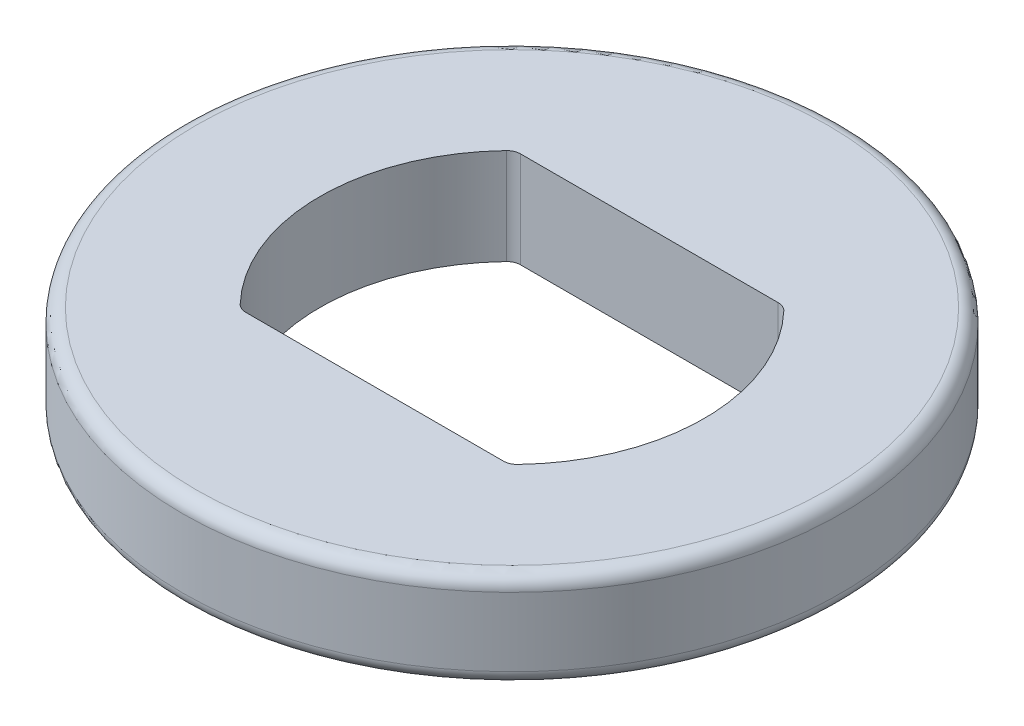
ISO-10303-21;
HEADER;
FILE_DESCRIPTION(('STEP AP214'),'2;1');
FILE_NAME('part.step','',(''),(''),'','','');
FILE_SCHEMA(('AUTOMOTIVE_DESIGN { 1 0 10303 214 1 1 1 1 }'));
ENDSEC;
DATA;
#1=APPLICATION_CONTEXT('core data for automotive mechanical design processes');
#2=APPLICATION_PROTOCOL_DEFINITION('international standard','automotive_design',2000,#1);
#3=PRODUCT_CONTEXT('',#1,'mechanical');
#4=PRODUCT('Part','Part','',(#3));
#5=PRODUCT_RELATED_PRODUCT_CATEGORY('part','',(#4));
#6=PRODUCT_DEFINITION_FORMATION('','',#4);
#7=PRODUCT_DEFINITION_CONTEXT('part definition',#1,'design');
#8=PRODUCT_DEFINITION('design','',#6,#7);
#9=PRODUCT_DEFINITION_SHAPE('','',#8);
#10=(LENGTH_UNIT() NAMED_UNIT(*) SI_UNIT(.MILLI.,.METRE.));
#11=(NAMED_UNIT(*) PLANE_ANGLE_UNIT() SI_UNIT($,.RADIAN.));
#12=(NAMED_UNIT(*) SI_UNIT($,.STERADIAN.) SOLID_ANGLE_UNIT());
#13=UNCERTAINTY_MEASURE_WITH_UNIT(LENGTH_MEASURE(1.E-05),#10,'distance_accuracy_value','');
#14=(GEOMETRIC_REPRESENTATION_CONTEXT(3) GLOBAL_UNCERTAINTY_ASSIGNED_CONTEXT((#13)) GLOBAL_UNIT_ASSIGNED_CONTEXT((#10,
#11,#12)) REPRESENTATION_CONTEXT('',''));
#15=CARTESIAN_POINT('',(0.,0.,0.));
#16=DIRECTION('',(0.,0.,1.));
#17=DIRECTION('',(1.,0.,0.));
#18=AXIS2_PLACEMENT_3D('',#15,#16,#17);
#19=CARTESIAN_POINT('',(0.,3.5,0.));
#20=DIRECTION('',(0.,-1.,0.));
#21=DIRECTION('',(0.,0.,-1.));
#22=AXIS2_PLACEMENT_3D('',#19,#20,#21);
#23=CYLINDRICAL_SURFACE('',#22,12.);
#24=CARTESIAN_POINT('',(0.,3.,0.));
#25=DIRECTION('',(0.,1.,0.));
#26=DIRECTION('',(0.,0.,1.));
#27=AXIS2_PLACEMENT_3D('',#24,#25,#26);
#28=CIRCLE('',#27,12.);
#29=CARTESIAN_POINT('',(0.,3.,12.));
#30=VERTEX_POINT('',#29);
#31=EDGE_CURVE('E176',#30,#30,#28,.F.);
#32=ORIENTED_EDGE('',*,*,#31,.T.);
#33=EDGE_LOOP('',(#32));
#34=FACE_BOUND('',#33,.T.);
#35=CARTESIAN_POINT('',(0.,0.5,0.));
#36=DIRECTION('',(0.,1.,0.));
#37=DIRECTION('',(0.,0.,1.));
#38=AXIS2_PLACEMENT_3D('',#35,#36,#37);
#39=CIRCLE('',#38,12.);
#40=CARTESIAN_POINT('',(0.,0.5,12.));
#41=VERTEX_POINT('',#40);
#42=EDGE_CURVE('E173',#41,#41,#39,.T.);
#43=ORIENTED_EDGE('',*,*,#42,.T.);
#44=EDGE_LOOP('',(#43));
#45=FACE_BOUND('',#44,.T.);
#46=ADVANCED_FACE('F34',(#34,#45),#23,.T.);
#47=CARTESIAN_POINT('',(0.,3.5,0.));
#48=DIRECTION('',(0.,1.,0.));
#49=DIRECTION('',(0.,0.,1.));
#50=AXIS2_PLACEMENT_3D('',#47,#48,#49);
#51=PLANE('',#50);
#52=CARTESIAN_POINT('',(0.,3.5,0.));
#53=DIRECTION('',(0.,1.,0.));
#54=DIRECTION('',(0.,0.,1.));
#55=AXIS2_PLACEMENT_3D('',#52,#53,#54);
#56=CIRCLE('',#55,11.5);
#57=CARTESIAN_POINT('',(0.,3.5,11.5));
#58=VERTEX_POINT('',#57);
#59=EDGE_CURVE('E163',#58,#58,#56,.T.);
#60=ORIENTED_EDGE('',*,*,#59,.T.);
#61=EDGE_LOOP('',(#60));
#62=FACE_BOUND('',#61,.T.);
#63=DIRECTION('',(1.,0.,0.));
#64=VECTOR('',#63,1.);
#65=CARTESIAN_POINT('',(4.89897948556636,3.5,-5.));
#66=LINE('',#65,#64);
#67=CARTESIAN_POINT('',(-4.69041575982343,3.5,-5.));
#68=VERTEX_POINT('',#67);
#69=CARTESIAN_POINT('',(4.69041575982343,3.5,-5.));
#70=VERTEX_POINT('',#69);
#71=EDGE_CURVE('E106',#68,#70,#66,.T.);
#72=ORIENTED_EDGE('',*,*,#71,.T.);
#73=CARTESIAN_POINT('',(4.69041575982343,3.5,-4.5));
#74=DIRECTION('',(0.,1.,0.));
#75=DIRECTION('',(0.,0.,1.));
#76=AXIS2_PLACEMENT_3D('',#73,#74,#75);
#77=CIRCLE('',#76,0.5);
#78=CARTESIAN_POINT('',(5.05121697211754,3.5,-4.84615384615384));
#79=VERTEX_POINT('',#78);
#80=EDGE_CURVE('E100',#70,#79,#77,.F.);
#81=ORIENTED_EDGE('',*,*,#80,.T.);
#82=CARTESIAN_POINT('',(0.,3.5,0.));
#83=DIRECTION('',(0.,-1.,0.));
#84=DIRECTION('',(0.,0.,-1.));
#85=AXIS2_PLACEMENT_3D('',#82,#83,#84);
#86=CIRCLE('',#85,7.);
#87=CARTESIAN_POINT('',(5.05121697211754,3.5,4.84615384615385));
#88=VERTEX_POINT('',#87);
#89=EDGE_CURVE('E103',#79,#88,#86,.T.);
#90=ORIENTED_EDGE('',*,*,#89,.T.);
#91=CARTESIAN_POINT('',(4.69041575982343,3.5,4.5));
#92=DIRECTION('',(0.,1.,0.));
#93=DIRECTION('',(0.,0.,1.));
#94=AXIS2_PLACEMENT_3D('',#91,#92,#93);
#95=CIRCLE('',#94,0.5);
#96=CARTESIAN_POINT('',(4.69041575982343,3.5,5.));
#97=VERTEX_POINT('',#96);
#98=EDGE_CURVE('E140',#88,#97,#95,.F.);
#99=ORIENTED_EDGE('',*,*,#98,.T.);
#100=DIRECTION('',(-1.,0.,0.));
#101=VECTOR('',#100,1.);
#102=CARTESIAN_POINT('',(4.89897948556635,3.5,5.));
#103=LINE('',#102,#101);
#104=CARTESIAN_POINT('',(-4.69041575982343,3.5,5.));
#105=VERTEX_POINT('',#104);
#106=EDGE_CURVE('E121',#97,#105,#103,.T.);
#107=ORIENTED_EDGE('',*,*,#106,.T.);
#108=CARTESIAN_POINT('',(-4.69041575982343,3.5,4.5));
#109=DIRECTION('',(0.,1.,0.));
#110=DIRECTION('',(0.,0.,1.));
#111=AXIS2_PLACEMENT_3D('',#108,#109,#110);
#112=CIRCLE('',#111,0.5);
#113=CARTESIAN_POINT('',(-5.05121697211754,3.5,4.84615384615385));
#114=VERTEX_POINT('',#113);
#115=EDGE_CURVE('E11',#105,#114,#112,.F.);
#116=ORIENTED_EDGE('',*,*,#115,.T.);
#117=CARTESIAN_POINT('',(0.,3.5,0.));
#118=DIRECTION('',(0.,-1.,0.));
#119=DIRECTION('',(0.,0.,-1.));
#120=AXIS2_PLACEMENT_3D('',#117,#118,#119);
#121=CIRCLE('',#120,7.);
#122=CARTESIAN_POINT('',(-5.05121697211754,3.5,-4.84615384615384));
#123=VERTEX_POINT('',#122);
#124=EDGE_CURVE('E157',#114,#123,#121,.T.);
#125=ORIENTED_EDGE('',*,*,#124,.T.);
#126=CARTESIAN_POINT('',(-4.69041575982343,3.5,-4.5));
#127=DIRECTION('',(0.,1.,0.));
#128=DIRECTION('',(0.,0.,1.));
#129=AXIS2_PLACEMENT_3D('',#126,#127,#128);
#130=CIRCLE('',#129,0.5);
#131=EDGE_CURVE('E136',#123,#68,#130,.F.);
#132=ORIENTED_EDGE('',*,*,#131,.T.);
#133=EDGE_LOOP('',(#72,#81,#90,#99,#107,#116,#125,#132));
#134=FACE_BOUND('',#133,.T.);
#135=ADVANCED_FACE('F102',(#62,#134),#51,.T.);
#136=CARTESIAN_POINT('',(0.,0.,0.));
#137=DIRECTION('',(0.,1.,0.));
#138=DIRECTION('',(0.,0.,1.));
#139=AXIS2_PLACEMENT_3D('',#136,#137,#138);
#140=PLANE('',#139);
#141=CARTESIAN_POINT('',(0.,0.,0.));
#142=DIRECTION('',(0.,1.,0.));
#143=DIRECTION('',(0.,0.,1.));
#144=AXIS2_PLACEMENT_3D('',#141,#142,#143);
#145=CIRCLE('',#144,11.5);
#146=CARTESIAN_POINT('',(0.,0.,11.5));
#147=VERTEX_POINT('',#146);
#148=EDGE_CURVE('E179',#147,#147,#145,.F.);
#149=ORIENTED_EDGE('',*,*,#148,.T.);
#150=EDGE_LOOP('',(#149));
#151=FACE_BOUND('',#150,.T.);
#152=DIRECTION('',(-1.,0.,0.));
#153=VECTOR('',#152,1.);
#154=CARTESIAN_POINT('',(4.89897948556635,0.,5.));
#155=LINE('',#154,#153);
#156=CARTESIAN_POINT('',(4.69041575982343,0.,5.));
#157=VERTEX_POINT('',#156);
#158=CARTESIAN_POINT('',(-4.69041575982343,0.,5.));
#159=VERTEX_POINT('',#158);
#160=EDGE_CURVE('E144',#157,#159,#155,.T.);
#161=ORIENTED_EDGE('',*,*,#160,.F.);
#162=CARTESIAN_POINT('',(4.69041575982343,0.,4.5));
#163=DIRECTION('',(0.,1.,0.));
#164=DIRECTION('',(0.,0.,1.));
#165=AXIS2_PLACEMENT_3D('',#162,#163,#164);
#166=CIRCLE('',#165,0.5);
#167=CARTESIAN_POINT('',(5.05121697211754,0.,4.84615384615385));
#168=VERTEX_POINT('',#167);
#169=EDGE_CURVE('E110',#157,#168,#166,.T.);
#170=ORIENTED_EDGE('',*,*,#169,.T.);
#171=CARTESIAN_POINT('',(0.,0.,0.));
#172=DIRECTION('',(0.,-1.,0.));
#173=DIRECTION('',(0.,0.,-1.));
#174=AXIS2_PLACEMENT_3D('',#171,#172,#173);
#175=CIRCLE('',#174,7.);
#176=CARTESIAN_POINT('',(5.05121697211754,0.,-4.84615384615384));
#177=VERTEX_POINT('',#176);
#178=EDGE_CURVE('E151',#177,#168,#175,.T.);
#179=ORIENTED_EDGE('',*,*,#178,.F.);
#180=CARTESIAN_POINT('',(4.69041575982343,0.,-4.5));
#181=DIRECTION('',(0.,1.,0.));
#182=DIRECTION('',(0.,0.,1.));
#183=AXIS2_PLACEMENT_3D('',#180,#181,#182);
#184=CIRCLE('',#183,0.5);
#185=CARTESIAN_POINT('',(4.69041575982343,0.,-5.));
#186=VERTEX_POINT('',#185);
#187=EDGE_CURVE('E111',#177,#186,#184,.T.);
#188=ORIENTED_EDGE('',*,*,#187,.T.);
#189=DIRECTION('',(1.,0.,0.));
#190=VECTOR('',#189,1.);
#191=CARTESIAN_POINT('',(4.89897948556636,0.,-5.));
#192=LINE('',#191,#190);
#193=CARTESIAN_POINT('',(-4.69041575982343,0.,-5.));
#194=VERTEX_POINT('',#193);
#195=EDGE_CURVE('E122',#194,#186,#192,.T.);
#196=ORIENTED_EDGE('',*,*,#195,.F.);
#197=CARTESIAN_POINT('',(-4.69041575982343,0.,-4.5));
#198=DIRECTION('',(0.,1.,0.));
#199=DIRECTION('',(0.,0.,1.));
#200=AXIS2_PLACEMENT_3D('',#197,#198,#199);
#201=CIRCLE('',#200,0.5);
#202=CARTESIAN_POINT('',(-5.05121697211754,0.,-4.84615384615384));
#203=VERTEX_POINT('',#202);
#204=EDGE_CURVE('E49',#194,#203,#201,.T.);
#205=ORIENTED_EDGE('',*,*,#204,.T.);
#206=CARTESIAN_POINT('',(0.,0.,0.));
#207=DIRECTION('',(0.,-1.,0.));
#208=DIRECTION('',(0.,0.,-1.));
#209=AXIS2_PLACEMENT_3D('',#206,#207,#208);
#210=CIRCLE('',#209,7.);
#211=CARTESIAN_POINT('',(-5.05121697211754,0.,4.84615384615385));
#212=VERTEX_POINT('',#211);
#213=EDGE_CURVE('E145',#212,#203,#210,.T.);
#214=ORIENTED_EDGE('',*,*,#213,.F.);
#215=CARTESIAN_POINT('',(-4.69041575982343,0.,4.5));
#216=DIRECTION('',(0.,1.,0.));
#217=DIRECTION('',(0.,0.,1.));
#218=AXIS2_PLACEMENT_3D('',#215,#216,#217);
#219=CIRCLE('',#218,0.5);
#220=EDGE_CURVE('E42',#212,#159,#219,.T.);
#221=ORIENTED_EDGE('',*,*,#220,.T.);
#222=EDGE_LOOP('',(#161,#170,#179,#188,#196,#205,#214,#221));
#223=FACE_BOUND('',#222,.T.);
#224=ADVANCED_FACE('F143',(#151,#223),#140,.F.);
#225=CARTESIAN_POINT('',(0.,3.5,0.));
#226=DIRECTION('',(0.,-1.,0.));
#227=DIRECTION('',(0.,0.,-1.));
#228=AXIS2_PLACEMENT_3D('',#225,#226,#227);
#229=CYLINDRICAL_SURFACE('',#228,7.);
#230=ORIENTED_EDGE('',*,*,#89,.F.);
#231=DIRECTION('',(0.,-1.,0.));
#232=VECTOR('',#231,1.);
#233=CARTESIAN_POINT('',(5.05121697211754,3.5,-4.84615384615384));
#234=LINE('',#233,#232);
#235=EDGE_CURVE('E117',#79,#177,#234,.T.);
#236=ORIENTED_EDGE('',*,*,#235,.T.);
#237=ORIENTED_EDGE('',*,*,#178,.T.);
#238=DIRECTION('',(0.,-1.,0.));
#239=VECTOR('',#238,1.);
#240=CARTESIAN_POINT('',(5.05121697211754,3.5,4.84615384615385));
#241=LINE('',#240,#239);
#242=EDGE_CURVE('E120',#168,#88,#241,.F.);
#243=ORIENTED_EDGE('',*,*,#242,.T.);
#244=EDGE_LOOP('',(#230,#236,#237,#243));
#245=FACE_BOUND('',#244,.T.);
#246=ADVANCED_FACE('F115',(#245),#229,.F.);
#247=CARTESIAN_POINT('',(4.89897948556636,3.5,-5.));
#248=DIRECTION('',(0.,0.,-1.));
#249=DIRECTION('',(-1.,0.,0.));
#250=AXIS2_PLACEMENT_3D('',#247,#248,#249);
#251=PLANE('',#250);
#252=ORIENTED_EDGE('',*,*,#71,.F.);
#253=DIRECTION('',(0.,1.,0.));
#254=VECTOR('',#253,1.);
#255=CARTESIAN_POINT('',(-4.69041575982343,0.,-5.));
#256=LINE('',#255,#254);
#257=EDGE_CURVE('E184',#68,#194,#256,.F.);
#258=ORIENTED_EDGE('',*,*,#257,.T.);
#259=ORIENTED_EDGE('',*,*,#195,.T.);
#260=DIRECTION('',(0.,1.,0.));
#261=VECTOR('',#260,1.);
#262=CARTESIAN_POINT('',(4.69041575982343,3.5,-5.));
#263=LINE('',#262,#261);
#264=EDGE_CURVE('E182',#186,#70,#263,.T.);
#265=ORIENTED_EDGE('',*,*,#264,.T.);
#266=EDGE_LOOP('',(#252,#258,#259,#265));
#267=FACE_BOUND('',#266,.T.);
#268=ADVANCED_FACE('F189',(#267),#251,.F.);
#269=CARTESIAN_POINT('',(0.,3.5,0.));
#270=DIRECTION('',(0.,-1.,0.));
#271=DIRECTION('',(0.,0.,-1.));
#272=AXIS2_PLACEMENT_3D('',#269,#270,#271);
#273=CYLINDRICAL_SURFACE('',#272,7.);
#274=ORIENTED_EDGE('',*,*,#213,.T.);
#275=DIRECTION('',(0.,-1.,0.));
#276=VECTOR('',#275,1.);
#277=CARTESIAN_POINT('',(-5.05121697211754,3.5,-4.84615384615384));
#278=LINE('',#277,#276);
#279=EDGE_CURVE('E129',#203,#123,#278,.F.);
#280=ORIENTED_EDGE('',*,*,#279,.T.);
#281=ORIENTED_EDGE('',*,*,#124,.F.);
#282=DIRECTION('',(0.,-1.,0.));
#283=VECTOR('',#282,1.);
#284=CARTESIAN_POINT('',(-5.05121697211754,3.5,4.84615384615385));
#285=LINE('',#284,#283);
#286=EDGE_CURVE('E154',#114,#212,#285,.T.);
#287=ORIENTED_EDGE('',*,*,#286,.T.);
#288=EDGE_LOOP('',(#274,#280,#281,#287));
#289=FACE_BOUND('',#288,.T.);
#290=ADVANCED_FACE('F160',(#289),#273,.F.);
#291=CARTESIAN_POINT('',(4.89897948556635,3.5,5.));
#292=DIRECTION('',(0.,0.,1.));
#293=DIRECTION('',(1.,0.,0.));
#294=AXIS2_PLACEMENT_3D('',#291,#292,#293);
#295=PLANE('',#294);
#296=ORIENTED_EDGE('',*,*,#106,.F.);
#297=DIRECTION('',(0.,1.,0.));
#298=VECTOR('',#297,1.);
#299=CARTESIAN_POINT('',(4.69041575982343,0.,5.));
#300=LINE('',#299,#298);
#301=EDGE_CURVE('E127',#97,#157,#300,.F.);
#302=ORIENTED_EDGE('',*,*,#301,.T.);
#303=ORIENTED_EDGE('',*,*,#160,.T.);
#304=DIRECTION('',(0.,1.,0.));
#305=VECTOR('',#304,1.);
#306=CARTESIAN_POINT('',(-4.69041575982343,3.5,5.));
#307=LINE('',#306,#305);
#308=EDGE_CURVE('E125',#159,#105,#307,.T.);
#309=ORIENTED_EDGE('',*,*,#308,.T.);
#310=EDGE_LOOP('',(#296,#302,#303,#309));
#311=FACE_BOUND('',#310,.T.);
#312=ADVANCED_FACE('F148',(#311),#295,.F.);
#313=CARTESIAN_POINT('',(0.,3.,0.));
#314=DIRECTION('',(0.,1.,0.));
#315=DIRECTION('',(0.,0.,1.));
#316=AXIS2_PLACEMENT_3D('',#313,#314,#315);
#317=TOROIDAL_SURFACE('',#316,11.5,0.5);
#318=ORIENTED_EDGE('',*,*,#31,.F.);
#319=EDGE_LOOP('',(#318));
#320=FACE_BOUND('',#319,.T.);
#321=ORIENTED_EDGE('',*,*,#59,.F.);
#322=EDGE_LOOP('',(#321));
#323=FACE_BOUND('',#322,.T.);
#324=ADVANCED_FACE('F211',(#320,#323),#317,.T.);
#325=CARTESIAN_POINT('',(0.,0.5,0.));
#326=DIRECTION('',(0.,1.,0.));
#327=DIRECTION('',(0.,0.,1.));
#328=AXIS2_PLACEMENT_3D('',#325,#326,#327);
#329=TOROIDAL_SURFACE('',#328,11.5,0.5);
#330=ORIENTED_EDGE('',*,*,#148,.F.);
#331=EDGE_LOOP('',(#330));
#332=FACE_BOUND('',#331,.T.);
#333=ORIENTED_EDGE('',*,*,#42,.F.);
#334=EDGE_LOOP('',(#333));
#335=FACE_BOUND('',#334,.T.);
#336=ADVANCED_FACE('F214',(#332,#335),#329,.T.);
#337=CARTESIAN_POINT('',(-4.69041575982343,3.5,-4.5));
#338=DIRECTION('',(0.,-1.,0.));
#339=DIRECTION('',(0.,0.,-1.));
#340=AXIS2_PLACEMENT_3D('',#337,#338,#339);
#341=CYLINDRICAL_SURFACE('',#340,0.5);
#342=ORIENTED_EDGE('',*,*,#131,.F.);
#343=ORIENTED_EDGE('',*,*,#279,.F.);
#344=ORIENTED_EDGE('',*,*,#204,.F.);
#345=ORIENTED_EDGE('',*,*,#257,.F.);
#346=EDGE_LOOP('',(#342,#343,#344,#345));
#347=FACE_BOUND('',#346,.T.);
#348=ADVANCED_FACE('F198',(#347),#341,.F.);
#349=CARTESIAN_POINT('',(4.69041575982343,3.5,-4.5));
#350=DIRECTION('',(0.,-1.,0.));
#351=DIRECTION('',(0.,0.,-1.));
#352=AXIS2_PLACEMENT_3D('',#349,#350,#351);
#353=CYLINDRICAL_SURFACE('',#352,0.5);
#354=ORIENTED_EDGE('',*,*,#80,.F.);
#355=ORIENTED_EDGE('',*,*,#264,.F.);
#356=ORIENTED_EDGE('',*,*,#187,.F.);
#357=ORIENTED_EDGE('',*,*,#235,.F.);
#358=EDGE_LOOP('',(#354,#355,#356,#357));
#359=FACE_BOUND('',#358,.T.);
#360=ADVANCED_FACE('F124',(#359),#353,.F.);
#361=CARTESIAN_POINT('',(4.69041575982343,3.5,4.5));
#362=DIRECTION('',(0.,-1.,0.));
#363=DIRECTION('',(0.,0.,-1.));
#364=AXIS2_PLACEMENT_3D('',#361,#362,#363);
#365=CYLINDRICAL_SURFACE('',#364,0.5);
#366=ORIENTED_EDGE('',*,*,#98,.F.);
#367=ORIENTED_EDGE('',*,*,#242,.F.);
#368=ORIENTED_EDGE('',*,*,#169,.F.);
#369=ORIENTED_EDGE('',*,*,#301,.F.);
#370=EDGE_LOOP('',(#366,#367,#368,#369));
#371=FACE_BOUND('',#370,.T.);
#372=ADVANCED_FACE('F192',(#371),#365,.F.);
#373=CARTESIAN_POINT('',(-4.69041575982343,3.5,4.5));
#374=DIRECTION('',(0.,-1.,0.));
#375=DIRECTION('',(0.,0.,-1.));
#376=AXIS2_PLACEMENT_3D('',#373,#374,#375);
#377=CYLINDRICAL_SURFACE('',#376,0.5);
#378=ORIENTED_EDGE('',*,*,#115,.F.);
#379=ORIENTED_EDGE('',*,*,#308,.F.);
#380=ORIENTED_EDGE('',*,*,#220,.F.);
#381=ORIENTED_EDGE('',*,*,#286,.F.);
#382=EDGE_LOOP('',(#378,#379,#380,#381));
#383=FACE_BOUND('',#382,.T.);
#384=ADVANCED_FACE('F36',(#383),#377,.F.);
#385=CLOSED_SHELL('',(#46,#135,#224,#246,#268,#290,#312,#324,#336,#348,#360,#372,#384));
#386=MANIFOLD_SOLID_BREP('B2',#385);
#387=ADVANCED_BREP_SHAPE_REPRESENTATION('',(#18,#386),#14);
#388=SHAPE_DEFINITION_REPRESENTATION(#9,#387);
ENDSEC;
END-ISO-10303-21;
